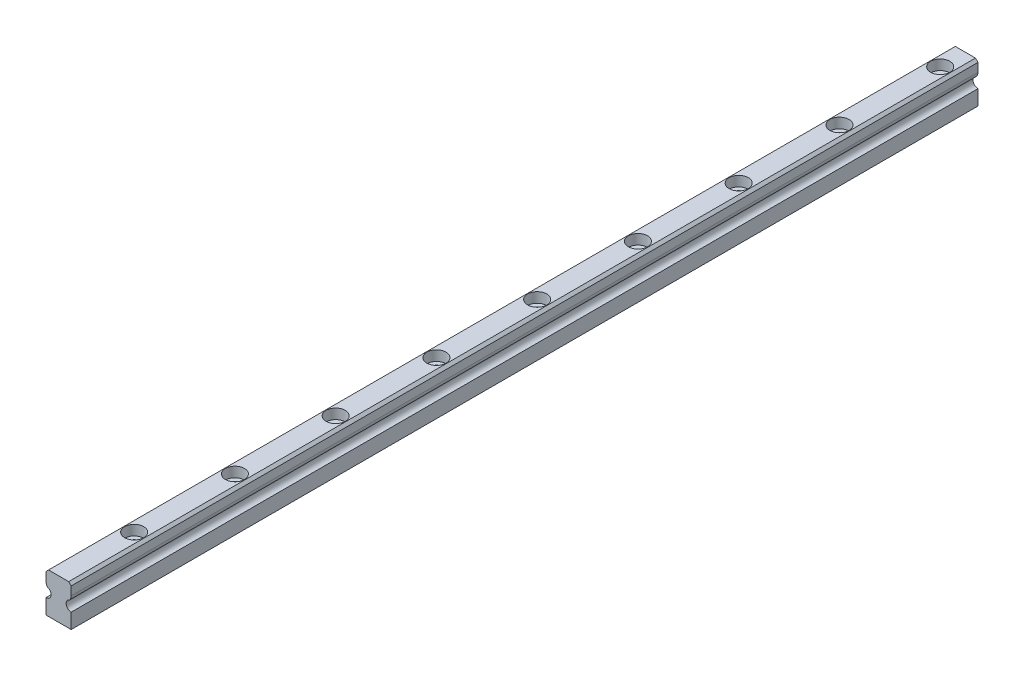
ISO-10303-21;
HEADER;
FILE_DESCRIPTION(('STEP AP214'),'2;1');
FILE_NAME('part.step','',(''),(''),'','','');
FILE_SCHEMA(('AUTOMOTIVE_DESIGN { 1 0 10303 214 1 1 1 1 }'));
ENDSEC;
DATA;
#1=APPLICATION_CONTEXT('core data for automotive mechanical design processes');
#2=APPLICATION_PROTOCOL_DEFINITION('international standard','automotive_design',2000,#1);
#3=PRODUCT_CONTEXT('',#1,'mechanical');
#4=PRODUCT('Part','Part','',(#3));
#5=PRODUCT_RELATED_PRODUCT_CATEGORY('part','',(#4));
#6=PRODUCT_DEFINITION_FORMATION('','',#4);
#7=PRODUCT_DEFINITION_CONTEXT('part definition',#1,'design');
#8=PRODUCT_DEFINITION('design','',#6,#7);
#9=PRODUCT_DEFINITION_SHAPE('','',#8);
#10=(LENGTH_UNIT() NAMED_UNIT(*) SI_UNIT(.MILLI.,.METRE.));
#11=(NAMED_UNIT(*) PLANE_ANGLE_UNIT() SI_UNIT($,.RADIAN.));
#12=(NAMED_UNIT(*) SI_UNIT($,.STERADIAN.) SOLID_ANGLE_UNIT());
#13=UNCERTAINTY_MEASURE_WITH_UNIT(LENGTH_MEASURE(1.E-05),#10,'distance_accuracy_value','');
#14=(GEOMETRIC_REPRESENTATION_CONTEXT(3) GLOBAL_UNCERTAINTY_ASSIGNED_CONTEXT((#13)) GLOBAL_UNIT_ASSIGNED_CONTEXT((#10,
#11,#12)) REPRESENTATION_CONTEXT('',''));
#15=CARTESIAN_POINT('',(0.,0.,0.));
#16=DIRECTION('',(0.,0.,1.));
#17=DIRECTION('',(1.,0.,0.));
#18=AXIS2_PLACEMENT_3D('',#15,#16,#17);
#19=CARTESIAN_POINT('',(-2.5,4.,185.));
#20=DIRECTION('',(1.,0.,0.));
#21=DIRECTION('',(0.,1.,0.));
#22=AXIS2_PLACEMENT_3D('',#19,#20,#21);
#23=PLANE('',#22);
#24=DIRECTION('',(0.,-1.,0.));
#25=VECTOR('',#24,1.);
#26=CARTESIAN_POINT('',(-2.5,3.49999999999997,-20.));
#27=LINE('',#26,#25);
#28=CARTESIAN_POINT('',(-2.5,3.49999999999997,-20.));
#29=VERTEX_POINT('',#28);
#30=CARTESIAN_POINT('',(-2.5,1.79820245321149,-20.));
#31=VERTEX_POINT('',#30);
#32=EDGE_CURVE('E414',#29,#31,#27,.T.);
#33=ORIENTED_EDGE('',*,*,#32,.F.);
#34=DIRECTION('',(0.,0.,-1.));
#35=VECTOR('',#34,1.);
#36=CARTESIAN_POINT('',(-2.5,3.49999999999997,185.));
#37=LINE('',#36,#35);
#38=CARTESIAN_POINT('',(-2.5,3.49999999999997,-200.));
#39=VERTEX_POINT('',#38);
#40=EDGE_CURVE('E185',#29,#39,#37,.T.);
#41=ORIENTED_EDGE('',*,*,#40,.T.);
#42=DIRECTION('',(0.,1.,0.));
#43=VECTOR('',#42,1.);
#44=CARTESIAN_POINT('',(-2.5,4.,-200.));
#45=LINE('',#44,#43);
#46=CARTESIAN_POINT('',(-2.5,1.79820245321149,-200.));
#47=VERTEX_POINT('',#46);
#48=EDGE_CURVE('E250',#47,#39,#45,.T.);
#49=ORIENTED_EDGE('',*,*,#48,.F.);
#50=DIRECTION('',(0.,0.,1.));
#51=VECTOR('',#50,1.);
#52=CARTESIAN_POINT('',(-2.5,1.79820245321149,-200.));
#53=LINE('',#52,#51);
#54=EDGE_CURVE('E160',#47,#31,#53,.T.);
#55=ORIENTED_EDGE('',*,*,#54,.T.);
#56=EDGE_LOOP('',(#33,#41,#49,#55));
#57=FACE_BOUND('',#56,.T.);
#58=ADVANCED_FACE('F50',(#57),#23,.F.);
#59=DIRECTION('',(0.,-1.,0.));
#60=VECTOR('',#59,1.);
#61=CARTESIAN_POINT('',(-2.5,-1.,-20.));
#62=LINE('',#61,#60);
#63=CARTESIAN_POINT('',(-2.5,-1.,-20.));
#64=VERTEX_POINT('',#63);
#65=CARTESIAN_POINT('',(-2.5,-4.,-20.));
#66=VERTEX_POINT('',#65);
#67=EDGE_CURVE('E432',#64,#66,#62,.T.);
#68=ORIENTED_EDGE('',*,*,#67,.F.);
#69=DIRECTION('',(0.,0.,1.));
#70=VECTOR('',#69,1.);
#71=CARTESIAN_POINT('',(-2.5,-1.,-200.));
#72=LINE('',#71,#70);
#73=CARTESIAN_POINT('',(-2.5,-1.,-200.));
#74=VERTEX_POINT('',#73);
#75=EDGE_CURVE('E175',#74,#64,#72,.T.);
#76=ORIENTED_EDGE('',*,*,#75,.F.);
#77=DIRECTION('',(0.,1.,0.));
#78=VECTOR('',#77,1.);
#79=CARTESIAN_POINT('',(-2.5,-1.,-200.));
#80=LINE('',#79,#78);
#81=CARTESIAN_POINT('',(-2.5,-4.,-200.));
#82=VERTEX_POINT('',#81);
#83=EDGE_CURVE('E365',#82,#74,#80,.T.);
#84=ORIENTED_EDGE('',*,*,#83,.F.);
#85=DIRECTION('',(0.,0.,-1.));
#86=VECTOR('',#85,1.);
#87=CARTESIAN_POINT('',(-2.5,-4.,185.));
#88=LINE('',#87,#86);
#89=EDGE_CURVE('E182',#66,#82,#88,.T.);
#90=ORIENTED_EDGE('',*,*,#89,.F.);
#91=EDGE_LOOP('',(#68,#76,#84,#90));
#92=FACE_BOUND('',#91,.T.);
#93=ADVANCED_FACE('F443',(#92),#23,.F.);
#94=CARTESIAN_POINT('',(2.5,-4.,185.));
#95=DIRECTION('',(0.,1.,0.));
#96=DIRECTION('',(-1.,0.,0.));
#97=AXIS2_PLACEMENT_3D('',#94,#95,#96);
#98=PLANE('',#97);
#99=CARTESIAN_POINT('',(1.67729882142548E-12,-4.,-195.));
#100=DIRECTION('',(0.,-1.,0.));
#101=DIRECTION('',(0.,0.,-1.));
#102=AXIS2_PLACEMENT_3D('',#99,#100,#101);
#103=CIRCLE('',#102,1.);
#104=CARTESIAN_POINT('',(1.67729882142548E-12,-4.,-196.));
#105=VERTEX_POINT('',#104);
#106=EDGE_CURVE('E223',#105,#105,#103,.T.);
#107=ORIENTED_EDGE('',*,*,#106,.F.);
#108=EDGE_LOOP('',(#107));
#109=FACE_BOUND('',#108,.T.);
#110=CARTESIAN_POINT('',(1.4678099410949E-12,-4.,-175.));
#111=DIRECTION('',(0.,-1.,0.));
#112=DIRECTION('',(0.,0.,-1.));
#113=AXIS2_PLACEMENT_3D('',#110,#111,#112);
#114=CIRCLE('',#113,1.);
#115=CARTESIAN_POINT('',(1.4678099410949E-12,-4.,-176.));
#116=VERTEX_POINT('',#115);
#117=EDGE_CURVE('E390',#116,#116,#114,.T.);
#118=ORIENTED_EDGE('',*,*,#117,.F.);
#119=EDGE_LOOP('',(#118));
#120=FACE_BOUND('',#119,.T.);
#121=CARTESIAN_POINT('',(1.25832106076431E-12,-4.,-155.));
#122=DIRECTION('',(0.,-1.,0.));
#123=DIRECTION('',(0.,0.,-1.));
#124=AXIS2_PLACEMENT_3D('',#121,#122,#123);
#125=CIRCLE('',#124,1.);
#126=CARTESIAN_POINT('',(1.25832106076431E-12,-4.,-156.));
#127=VERTEX_POINT('',#126);
#128=EDGE_CURVE('E386',#127,#127,#125,.T.);
#129=ORIENTED_EDGE('',*,*,#128,.F.);
#130=EDGE_LOOP('',(#129));
#131=FACE_BOUND('',#130,.T.);
#132=CARTESIAN_POINT('',(1.04883218043372E-12,-4.,-135.));
#133=DIRECTION('',(0.,-1.,0.));
#134=DIRECTION('',(0.,0.,-1.));
#135=AXIS2_PLACEMENT_3D('',#132,#133,#134);
#136=CIRCLE('',#135,1.);
#137=CARTESIAN_POINT('',(1.04883218043372E-12,-4.,-136.));
#138=VERTEX_POINT('',#137);
#139=EDGE_CURVE('E382',#138,#138,#136,.T.);
#140=ORIENTED_EDGE('',*,*,#139,.F.);
#141=EDGE_LOOP('',(#140));
#142=FACE_BOUND('',#141,.T.);
#143=CARTESIAN_POINT('',(8.39343300103133E-13,-4.,-115.));
#144=DIRECTION('',(0.,-1.,0.));
#145=DIRECTION('',(0.,0.,-1.));
#146=AXIS2_PLACEMENT_3D('',#143,#144,#145);
#147=CIRCLE('',#146,1.);
#148=CARTESIAN_POINT('',(8.39343300103133E-13,-4.,-116.));
#149=VERTEX_POINT('',#148);
#150=EDGE_CURVE('E378',#149,#149,#147,.T.);
#151=ORIENTED_EDGE('',*,*,#150,.F.);
#152=EDGE_LOOP('',(#151));
#153=FACE_BOUND('',#152,.T.);
#154=CARTESIAN_POINT('',(6.29854419772545E-13,-4.,-95.));
#155=DIRECTION('',(0.,-1.,0.));
#156=DIRECTION('',(0.,0.,-1.));
#157=AXIS2_PLACEMENT_3D('',#154,#155,#156);
#158=CIRCLE('',#157,1.);
#159=CARTESIAN_POINT('',(6.29854419772545E-13,-4.,-96.));
#160=VERTEX_POINT('',#159);
#161=EDGE_CURVE('E374',#160,#160,#158,.T.);
#162=ORIENTED_EDGE('',*,*,#161,.F.);
#163=EDGE_LOOP('',(#162));
#164=FACE_BOUND('',#163,.T.);
#165=CARTESIAN_POINT('',(4.20365539441957E-13,-4.,-75.));
#166=DIRECTION('',(0.,-1.,0.));
#167=DIRECTION('',(0.,0.,-1.));
#168=AXIS2_PLACEMENT_3D('',#165,#166,#167);
#169=CIRCLE('',#168,1.);
#170=CARTESIAN_POINT('',(4.20365539441957E-13,-4.,-76.));
#171=VERTEX_POINT('',#170);
#172=EDGE_CURVE('E370',#171,#171,#169,.T.);
#173=ORIENTED_EDGE('',*,*,#172,.F.);
#174=EDGE_LOOP('',(#173));
#175=FACE_BOUND('',#174,.T.);
#176=CARTESIAN_POINT('',(2.10876659111369E-13,-4.,-55.));
#177=DIRECTION('',(0.,-1.,0.));
#178=DIRECTION('',(0.,0.,-1.));
#179=AXIS2_PLACEMENT_3D('',#176,#177,#178);
#180=CIRCLE('',#179,1.);
#181=CARTESIAN_POINT('',(2.10876659111369E-13,-4.,-56.));
#182=VERTEX_POINT('',#181);
#183=EDGE_CURVE('E366',#182,#182,#180,.T.);
#184=ORIENTED_EDGE('',*,*,#183,.F.);
#185=EDGE_LOOP('',(#184));
#186=FACE_BOUND('',#185,.T.);
#187=CARTESIAN_POINT('',(0.,-4.,-35.));
#188=DIRECTION('',(0.,-1.,0.));
#189=DIRECTION('',(0.,0.,-1.));
#190=AXIS2_PLACEMENT_3D('',#187,#188,#189);
#191=CIRCLE('',#190,1.);
#192=CARTESIAN_POINT('',(0.,-4.,-36.));
#193=VERTEX_POINT('',#192);
#194=EDGE_CURVE('E361',#193,#193,#191,.T.);
#195=ORIENTED_EDGE('',*,*,#194,.F.);
#196=EDGE_LOOP('',(#195));
#197=FACE_BOUND('',#196,.T.);
#198=DIRECTION('',(1.,0.,0.));
#199=VECTOR('',#198,1.);
#200=CARTESIAN_POINT('',(-2.5,-4.,-20.));
#201=LINE('',#200,#199);
#202=CARTESIAN_POINT('',(2.5,-4.,-20.));
#203=VERTEX_POINT('',#202);
#204=EDGE_CURVE('E291',#66,#203,#201,.T.);
#205=ORIENTED_EDGE('',*,*,#204,.F.);
#206=ORIENTED_EDGE('',*,*,#89,.T.);
#207=DIRECTION('',(-1.,0.,0.));
#208=VECTOR('',#207,1.);
#209=CARTESIAN_POINT('',(-2.5,-4.,-200.));
#210=LINE('',#209,#208);
#211=CARTESIAN_POINT('',(2.5,-4.,-200.));
#212=VERTEX_POINT('',#211);
#213=EDGE_CURVE('E268',#212,#82,#210,.T.);
#214=ORIENTED_EDGE('',*,*,#213,.F.);
#215=DIRECTION('',(0.,0.,-1.));
#216=VECTOR('',#215,1.);
#217=CARTESIAN_POINT('',(2.5,-4.,185.));
#218=LINE('',#217,#216);
#219=EDGE_CURVE('E179',#203,#212,#218,.T.);
#220=ORIENTED_EDGE('',*,*,#219,.F.);
#221=EDGE_LOOP('',(#205,#206,#214,#220));
#222=FACE_BOUND('',#221,.T.);
#223=ADVANCED_FACE('F439',(#109,#120,#131,#142,#153,#164,#175,#186,#197,#222),#98,.F.);
#224=CARTESIAN_POINT('',(2.5,4.,185.));
#225=DIRECTION('',(-1.,0.,0.));
#226=DIRECTION('',(0.,-1.,0.));
#227=AXIS2_PLACEMENT_3D('',#224,#225,#226);
#228=PLANE('',#227);
#229=DIRECTION('',(0.,1.,0.));
#230=VECTOR('',#229,1.);
#231=CARTESIAN_POINT('',(2.5,-4.,-20.));
#232=LINE('',#231,#230);
#233=CARTESIAN_POINT('',(2.5,-1.,-20.));
#234=VERTEX_POINT('',#233);
#235=EDGE_CURVE('E278',#203,#234,#232,.T.);
#236=ORIENTED_EDGE('',*,*,#235,.F.);
#237=ORIENTED_EDGE('',*,*,#219,.T.);
#238=DIRECTION('',(0.,-1.,0.));
#239=VECTOR('',#238,1.);
#240=CARTESIAN_POINT('',(2.5,-4.,-200.));
#241=LINE('',#240,#239);
#242=CARTESIAN_POINT('',(2.5,-1.,-200.));
#243=VERTEX_POINT('',#242);
#244=EDGE_CURVE('E264',#243,#212,#241,.T.);
#245=ORIENTED_EDGE('',*,*,#244,.F.);
#246=DIRECTION('',(0.,0.,1.));
#247=VECTOR('',#246,1.);
#248=CARTESIAN_POINT('',(2.5,-1.,-200.));
#249=LINE('',#248,#247);
#250=EDGE_CURVE('E168',#243,#234,#249,.T.);
#251=ORIENTED_EDGE('',*,*,#250,.T.);
#252=EDGE_LOOP('',(#236,#237,#245,#251));
#253=FACE_BOUND('',#252,.T.);
#254=ADVANCED_FACE('F277',(#253),#228,.F.);
#255=DIRECTION('',(0.,1.,0.));
#256=VECTOR('',#255,1.);
#257=CARTESIAN_POINT('',(2.5,1.7982024532115,-20.));
#258=LINE('',#257,#256);
#259=CARTESIAN_POINT('',(2.5,1.7982024532115,-20.));
#260=VERTEX_POINT('',#259);
#261=CARTESIAN_POINT('',(2.5,3.49999999999997,-20.));
#262=VERTEX_POINT('',#261);
#263=EDGE_CURVE('E66',#260,#262,#258,.T.);
#264=ORIENTED_EDGE('',*,*,#263,.F.);
#265=DIRECTION('',(0.,0.,1.));
#266=VECTOR('',#265,1.);
#267=CARTESIAN_POINT('',(2.5,1.7982024532115,-200.));
#268=LINE('',#267,#266);
#269=CARTESIAN_POINT('',(2.5,1.7982024532115,-200.));
#270=VERTEX_POINT('',#269);
#271=EDGE_CURVE('E151',#270,#260,#268,.T.);
#272=ORIENTED_EDGE('',*,*,#271,.F.);
#273=DIRECTION('',(0.,-1.,0.));
#274=VECTOR('',#273,1.);
#275=CARTESIAN_POINT('',(2.5,4.,-200.));
#276=LINE('',#275,#274);
#277=CARTESIAN_POINT('',(2.5,3.49999999999997,-200.));
#278=VERTEX_POINT('',#277);
#279=EDGE_CURVE('E249',#278,#270,#276,.T.);
#280=ORIENTED_EDGE('',*,*,#279,.F.);
#281=DIRECTION('',(0.,0.,1.));
#282=VECTOR('',#281,1.);
#283=CARTESIAN_POINT('',(2.5,3.49999999999997,185.));
#284=LINE('',#283,#282);
#285=EDGE_CURVE('E13',#278,#262,#284,.T.);
#286=ORIENTED_EDGE('',*,*,#285,.T.);
#287=EDGE_LOOP('',(#264,#272,#280,#286));
#288=FACE_BOUND('',#287,.T.);
#289=ADVANCED_FACE('F150',(#288),#228,.F.);
#290=CARTESIAN_POINT('',(2.5,4.,185.));
#291=DIRECTION('',(0.,-1.,0.));
#292=DIRECTION('',(0.,0.,-1.));
#293=AXIS2_PLACEMENT_3D('',#290,#291,#292);
#294=PLANE('',#293);
#295=CARTESIAN_POINT('',(3.35320986407019E-12,4.,-35.));
#296=DIRECTION('',(0.,1.,0.));
#297=DIRECTION('',(-1.,0.,0.));
#298=AXIS2_PLACEMENT_3D('',#295,#296,#297);
#299=CIRCLE('',#298,1.9);
#300=CARTESIAN_POINT('',(-1.89999999999665,4.,-35.));
#301=VERTEX_POINT('',#300);
#302=EDGE_CURVE('E284',#301,#301,#299,.T.);
#303=ORIENTED_EDGE('',*,*,#302,.F.);
#304=EDGE_LOOP('',(#303));
#305=FACE_BOUND('',#304,.T.);
#306=CARTESIAN_POINT('',(3.1437209837396E-12,4.,-55.));
#307=DIRECTION('',(0.,1.,0.));
#308=DIRECTION('',(-1.,0.,0.));
#309=AXIS2_PLACEMENT_3D('',#306,#307,#308);
#310=CIRCLE('',#309,1.9);
#311=CARTESIAN_POINT('',(-1.89999999999686,4.,-55.));
#312=VERTEX_POINT('',#311);
#313=EDGE_CURVE('E354',#312,#312,#310,.T.);
#314=ORIENTED_EDGE('',*,*,#313,.F.);
#315=EDGE_LOOP('',(#314));
#316=FACE_BOUND('',#315,.T.);
#317=CARTESIAN_POINT('',(2.93423210340901E-12,4.,-75.));
#318=DIRECTION('',(0.,1.,0.));
#319=DIRECTION('',(-1.,0.,0.));
#320=AXIS2_PLACEMENT_3D('',#317,#318,#319);
#321=CIRCLE('',#320,1.9);
#322=CARTESIAN_POINT('',(-1.89999999999707,4.,-75.));
#323=VERTEX_POINT('',#322);
#324=EDGE_CURVE('E346',#323,#323,#321,.T.);
#325=ORIENTED_EDGE('',*,*,#324,.F.);
#326=EDGE_LOOP('',(#325));
#327=FACE_BOUND('',#326,.T.);
#328=CARTESIAN_POINT('',(2.72474322307842E-12,4.,-95.));
#329=DIRECTION('',(0.,1.,0.));
#330=DIRECTION('',(-1.,0.,0.));
#331=AXIS2_PLACEMENT_3D('',#328,#329,#330);
#332=CIRCLE('',#331,1.9);
#333=CARTESIAN_POINT('',(-1.89999999999728,4.,-95.));
#334=VERTEX_POINT('',#333);
#335=EDGE_CURVE('E338',#334,#334,#332,.T.);
#336=ORIENTED_EDGE('',*,*,#335,.F.);
#337=EDGE_LOOP('',(#336));
#338=FACE_BOUND('',#337,.T.);
#339=CARTESIAN_POINT('',(2.51525434274784E-12,4.,-115.));
#340=DIRECTION('',(0.,1.,0.));
#341=DIRECTION('',(-1.,0.,0.));
#342=AXIS2_PLACEMENT_3D('',#339,#340,#341);
#343=CIRCLE('',#342,1.9);
#344=CARTESIAN_POINT('',(-1.89999999999749,4.,-115.));
#345=VERTEX_POINT('',#344);
#346=EDGE_CURVE('E330',#345,#345,#343,.T.);
#347=ORIENTED_EDGE('',*,*,#346,.F.);
#348=EDGE_LOOP('',(#347));
#349=FACE_BOUND('',#348,.T.);
#350=CARTESIAN_POINT('',(2.30576546241725E-12,4.,-135.));
#351=DIRECTION('',(0.,1.,0.));
#352=DIRECTION('',(-1.,0.,0.));
#353=AXIS2_PLACEMENT_3D('',#350,#351,#352);
#354=CIRCLE('',#353,1.90000000000001);
#355=CARTESIAN_POINT('',(-1.8999999999977,4.,-135.));
#356=VERTEX_POINT('',#355);
#357=EDGE_CURVE('E322',#356,#356,#354,.T.);
#358=ORIENTED_EDGE('',*,*,#357,.F.);
#359=EDGE_LOOP('',(#358));
#360=FACE_BOUND('',#359,.T.);
#361=CARTESIAN_POINT('',(2.09627658208666E-12,4.,-155.));
#362=DIRECTION('',(0.,1.,0.));
#363=DIRECTION('',(-1.,0.,0.));
#364=AXIS2_PLACEMENT_3D('',#361,#362,#363);
#365=CIRCLE('',#364,1.90000000000001);
#366=CARTESIAN_POINT('',(-1.89999999999791,4.,-155.));
#367=VERTEX_POINT('',#366);
#368=EDGE_CURVE('E314',#367,#367,#365,.T.);
#369=ORIENTED_EDGE('',*,*,#368,.F.);
#370=EDGE_LOOP('',(#369));
#371=FACE_BOUND('',#370,.T.);
#372=CARTESIAN_POINT('',(1.88678770175607E-12,4.,-175.));
#373=DIRECTION('',(0.,1.,0.));
#374=DIRECTION('',(-1.,0.,0.));
#375=AXIS2_PLACEMENT_3D('',#372,#373,#374);
#376=CIRCLE('',#375,1.90000000000001);
#377=CARTESIAN_POINT('',(-1.89999999999812,4.,-175.));
#378=VERTEX_POINT('',#377);
#379=EDGE_CURVE('E306',#378,#378,#376,.T.);
#380=ORIENTED_EDGE('',*,*,#379,.F.);
#381=EDGE_LOOP('',(#380));
#382=FACE_BOUND('',#381,.T.);
#383=CARTESIAN_POINT('',(1.67729882142548E-12,4.,-195.));
#384=DIRECTION('',(0.,1.,0.));
#385=DIRECTION('',(-1.,0.,0.));
#386=AXIS2_PLACEMENT_3D('',#383,#384,#385);
#387=CIRCLE('',#386,1.90000000000001);
#388=CARTESIAN_POINT('',(-1.89999999999833,4.,-195.));
#389=VERTEX_POINT('',#388);
#390=EDGE_CURVE('E298',#389,#389,#387,.T.);
#391=ORIENTED_EDGE('',*,*,#390,.F.);
#392=EDGE_LOOP('',(#391));
#393=FACE_BOUND('',#392,.T.);
#394=DIRECTION('',(-1.,0.,0.));
#395=VECTOR('',#394,1.);
#396=CARTESIAN_POINT('',(1.99999999999997,4.,-20.));
#397=LINE('',#396,#395);
#398=CARTESIAN_POINT('',(1.99999999999997,4.,-20.));
#399=VERTEX_POINT('',#398);
#400=CARTESIAN_POINT('',(-2.,4.,-20.));
#401=VERTEX_POINT('',#400);
#402=EDGE_CURVE('E243',#399,#401,#397,.T.);
#403=ORIENTED_EDGE('',*,*,#402,.F.);
#404=DIRECTION('',(0.,0.,-1.));
#405=VECTOR('',#404,1.);
#406=CARTESIAN_POINT('',(1.99999999999997,4.,185.));
#407=LINE('',#406,#405);
#408=CARTESIAN_POINT('',(1.99999999999997,4.,-200.));
#409=VERTEX_POINT('',#408);
#410=EDGE_CURVE('E233',#399,#409,#407,.T.);
#411=ORIENTED_EDGE('',*,*,#410,.T.);
#412=DIRECTION('',(1.,0.,0.));
#413=VECTOR('',#412,1.);
#414=CARTESIAN_POINT('',(2.5,4.,-200.));
#415=LINE('',#414,#413);
#416=CARTESIAN_POINT('',(-2.,4.,-200.));
#417=VERTEX_POINT('',#416);
#418=EDGE_CURVE('E241',#417,#409,#415,.T.);
#419=ORIENTED_EDGE('',*,*,#418,.F.);
#420=DIRECTION('',(0.,0.,1.));
#421=VECTOR('',#420,1.);
#422=CARTESIAN_POINT('',(-2.,4.,185.));
#423=LINE('',#422,#421);
#424=EDGE_CURVE('E229',#417,#401,#423,.T.);
#425=ORIENTED_EDGE('',*,*,#424,.T.);
#426=EDGE_LOOP('',(#403,#411,#419,#425));
#427=FACE_BOUND('',#426,.T.);
#428=ADVANCED_FACE('F240',(#305,#316,#327,#338,#349,#360,#371,#382,#393,#427),#294,.F.);
#429=CARTESIAN_POINT('',(-2.5,0.,-200.));
#430=DIRECTION('',(0.,0.,1.));
#431=DIRECTION('',(1.,0.,0.));
#432=AXIS2_PLACEMENT_3D('',#429,#430,#431);
#433=CYLINDRICAL_SURFACE('',#432,1.);
#434=CARTESIAN_POINT('',(-2.5,0.,-20.));
#435=DIRECTION('',(0.,0.,-1.));
#436=DIRECTION('',(1.,0.,0.));
#437=AXIS2_PLACEMENT_3D('',#434,#435,#436);
#438=CIRCLE('',#437,1.);
#439=CARTESIAN_POINT('',(-2.20143290006781,0.95438864559365,-20.));
#440=VERTEX_POINT('',#439);
#441=EDGE_CURVE('E429',#440,#64,#438,.T.);
#442=ORIENTED_EDGE('',*,*,#441,.F.);
#443=DIRECTION('',(0.,0.,1.));
#444=VECTOR('',#443,1.);
#445=CARTESIAN_POINT('',(-2.20143290006781,0.95438864559365,-200.));
#446=LINE('',#445,#444);
#447=CARTESIAN_POINT('',(-2.20143290006781,0.95438864559365,-200.));
#448=VERTEX_POINT('',#447);
#449=EDGE_CURVE('E166',#448,#440,#446,.T.);
#450=ORIENTED_EDGE('',*,*,#449,.F.);
#451=CARTESIAN_POINT('',(-2.5,0.,-200.));
#452=DIRECTION('',(0.,0.,1.));
#453=DIRECTION('',(1.,0.,0.));
#454=AXIS2_PLACEMENT_3D('',#451,#452,#453);
#455=CIRCLE('',#454,1.);
#456=EDGE_CURVE('E400',#74,#448,#455,.T.);
#457=ORIENTED_EDGE('',*,*,#456,.F.);
#458=ORIENTED_EDGE('',*,*,#75,.T.);
#459=EDGE_LOOP('',(#442,#450,#457,#458));
#460=FACE_BOUND('',#459,.T.);
#461=ADVANCED_FACE('F447',(#460),#433,.F.);
#462=CARTESIAN_POINT('',(-1.15831825530943,1.79820245321149,-200.));
#463=DIRECTION('',(0.,0.,1.));
#464=DIRECTION('',(1.,0.,0.));
#465=AXIS2_PLACEMENT_3D('',#462,#463,#464);
#466=CYLINDRICAL_SURFACE('',#465,1.34168174469057);
#467=CARTESIAN_POINT('',(-1.15831825530943,1.79820245321149,-20.));
#468=DIRECTION('',(0.,0.,1.));
#469=DIRECTION('',(1.,0.,0.));
#470=AXIS2_PLACEMENT_3D('',#467,#468,#469);
#471=CIRCLE('',#470,1.34168174469057);
#472=EDGE_CURVE('E410',#31,#440,#471,.T.);
#473=ORIENTED_EDGE('',*,*,#472,.F.);
#474=ORIENTED_EDGE('',*,*,#54,.F.);
#475=CARTESIAN_POINT('',(-1.15831825530943,1.79820245321149,-200.));
#476=DIRECTION('',(0.,0.,-1.));
#477=DIRECTION('',(1.,0.,0.));
#478=AXIS2_PLACEMENT_3D('',#475,#476,#477);
#479=CIRCLE('',#478,1.34168174469057);
#480=EDGE_CURVE('E255',#448,#47,#479,.T.);
#481=ORIENTED_EDGE('',*,*,#480,.F.);
#482=ORIENTED_EDGE('',*,*,#449,.T.);
#483=EDGE_LOOP('',(#473,#474,#481,#482));
#484=FACE_BOUND('',#483,.T.);
#485=ADVANCED_FACE('F409',(#484),#466,.T.);
#486=CARTESIAN_POINT('',(1.15831825530943,1.79820245321149,-200.));
#487=DIRECTION('',(0.,0.,1.));
#488=DIRECTION('',(1.,0.,0.));
#489=AXIS2_PLACEMENT_3D('',#486,#487,#488);
#490=CYLINDRICAL_SURFACE('',#489,1.34168174469057);
#491=CARTESIAN_POINT('',(1.15831825530943,1.79820245321149,-20.));
#492=DIRECTION('',(0.,0.,1.));
#493=DIRECTION('',(1.,0.,0.));
#494=AXIS2_PLACEMENT_3D('',#491,#492,#493);
#495=CIRCLE('',#494,1.34168174469057);
#496=CARTESIAN_POINT('',(2.20143290006781,0.954388645593651,-20.));
#497=VERTEX_POINT('',#496);
#498=EDGE_CURVE('E138',#497,#260,#495,.T.);
#499=ORIENTED_EDGE('',*,*,#498,.F.);
#500=DIRECTION('',(0.,0.,1.));
#501=VECTOR('',#500,1.);
#502=CARTESIAN_POINT('',(2.20143290006781,0.954388645593651,-200.));
#503=LINE('',#502,#501);
#504=CARTESIAN_POINT('',(2.20143290006781,0.954388645593651,-200.));
#505=VERTEX_POINT('',#504);
#506=EDGE_CURVE('E161',#505,#497,#503,.T.);
#507=ORIENTED_EDGE('',*,*,#506,.F.);
#508=CARTESIAN_POINT('',(1.15831825530943,1.79820245321149,-200.));
#509=DIRECTION('',(0.,0.,-1.));
#510=DIRECTION('',(-1.,0.,0.));
#511=AXIS2_PLACEMENT_3D('',#508,#509,#510);
#512=CIRCLE('',#511,1.34168174469057);
#513=EDGE_CURVE('E158',#270,#505,#512,.T.);
#514=ORIENTED_EDGE('',*,*,#513,.F.);
#515=ORIENTED_EDGE('',*,*,#271,.T.);
#516=EDGE_LOOP('',(#499,#507,#514,#515));
#517=FACE_BOUND('',#516,.T.);
#518=ADVANCED_FACE('F157',(#517),#490,.T.);
#519=CARTESIAN_POINT('',(2.5,0.,-200.));
#520=DIRECTION('',(0.,0.,1.));
#521=DIRECTION('',(1.,0.,0.));
#522=AXIS2_PLACEMENT_3D('',#519,#520,#521);
#523=CYLINDRICAL_SURFACE('',#522,1.);
#524=CARTESIAN_POINT('',(2.5,0.,-20.));
#525=DIRECTION('',(0.,0.,-1.));
#526=DIRECTION('',(1.,0.,0.));
#527=AXIS2_PLACEMENT_3D('',#524,#525,#526);
#528=CIRCLE('',#527,1.);
#529=EDGE_CURVE('E141',#234,#497,#528,.T.);
#530=ORIENTED_EDGE('',*,*,#529,.F.);
#531=ORIENTED_EDGE('',*,*,#250,.F.);
#532=CARTESIAN_POINT('',(2.5,0.,-200.));
#533=DIRECTION('',(0.,0.,1.));
#534=DIRECTION('',(-1.,0.,0.));
#535=AXIS2_PLACEMENT_3D('',#532,#533,#534);
#536=CIRCLE('',#535,1.);
#537=EDGE_CURVE('E261',#505,#243,#536,.T.);
#538=ORIENTED_EDGE('',*,*,#537,.F.);
#539=ORIENTED_EDGE('',*,*,#506,.T.);
#540=EDGE_LOOP('',(#530,#531,#538,#539));
#541=FACE_BOUND('',#540,.T.);
#542=ADVANCED_FACE('F282',(#541),#523,.F.);
#543=CARTESIAN_POINT('',(-2.5,3.49999999999997,185.));
#544=DIRECTION('',(0.707106781186567,-0.707106781186528,0.));
#545=DIRECTION('',(0.,0.,-1.));
#546=AXIS2_PLACEMENT_3D('',#543,#544,#545);
#547=PLANE('',#546);
#548=ORIENTED_EDGE('',*,*,#40,.F.);
#549=DIRECTION('',(-0.707106781186528,-0.707106781186567,0.));
#550=VECTOR('',#549,1.);
#551=CARTESIAN_POINT('',(-2.,4.,-20.));
#552=LINE('',#551,#550);
#553=EDGE_CURVE('E418',#401,#29,#552,.T.);
#554=ORIENTED_EDGE('',*,*,#553,.F.);
#555=ORIENTED_EDGE('',*,*,#424,.F.);
#556=DIRECTION('',(-0.707106781186528,-0.707106781186567,0.));
#557=VECTOR('',#556,1.);
#558=CARTESIAN_POINT('',(-1.75000000000013,4.24999999999989,-200.));
#559=LINE('',#558,#557);
#560=EDGE_CURVE('E226',#39,#417,#559,.F.);
#561=ORIENTED_EDGE('',*,*,#560,.F.);
#562=EDGE_LOOP('',(#548,#554,#555,#561));
#563=FACE_BOUND('',#562,.T.);
#564=ADVANCED_FACE('F417',(#563),#547,.F.);
#565=CARTESIAN_POINT('',(1.99999999999997,4.,185.));
#566=DIRECTION('',(-0.707106781186548,-0.707106781186548,0.));
#567=DIRECTION('',(0.,0.,-1.));
#568=AXIS2_PLACEMENT_3D('',#565,#566,#567);
#569=PLANE('',#568);
#570=ORIENTED_EDGE('',*,*,#410,.F.);
#571=DIRECTION('',(-0.707106781186548,0.707106781186548,0.));
#572=VECTOR('',#571,1.);
#573=CARTESIAN_POINT('',(2.5,3.49999999999997,-20.));
#574=LINE('',#573,#572);
#575=EDGE_CURVE('E155',#262,#399,#574,.T.);
#576=ORIENTED_EDGE('',*,*,#575,.F.);
#577=ORIENTED_EDGE('',*,*,#285,.F.);
#578=DIRECTION('',(-0.707106781186548,0.707106781186548,0.));
#579=VECTOR('',#578,1.);
#580=CARTESIAN_POINT('',(4.24999999999999,1.74999999999999,-200.));
#581=LINE('',#580,#579);
#582=EDGE_CURVE('E59',#409,#278,#581,.F.);
#583=ORIENTED_EDGE('',*,*,#582,.F.);
#584=EDGE_LOOP('',(#570,#576,#577,#583));
#585=FACE_BOUND('',#584,.T.);
#586=ADVANCED_FACE('F52',(#585),#569,.F.);
#587=CARTESIAN_POINT('',(1.67729882142548E-12,4.001,-195.));
#588=DIRECTION('',(0.,-1.,0.));
#589=DIRECTION('',(0.,0.,-1.));
#590=AXIS2_PLACEMENT_3D('',#587,#588,#589);
#591=CYLINDRICAL_SURFACE('',#590,1.);
#592=ORIENTED_EDGE('',*,*,#106,.T.);
#593=EDGE_LOOP('',(#592));
#594=FACE_BOUND('',#593,.T.);
#595=CARTESIAN_POINT('',(1.67729882142548E-12,2.,-195.));
#596=DIRECTION('',(0.,1.,0.));
#597=DIRECTION('',(-1.,0.,0.));
#598=AXIS2_PLACEMENT_3D('',#595,#596,#597);
#599=CIRCLE('',#598,1.);
#600=CARTESIAN_POINT('',(-0.999999999998324,2.,-195.));
#601=VERTEX_POINT('',#600);
#602=EDGE_CURVE('E219',#601,#601,#599,.F.);
#603=ORIENTED_EDGE('',*,*,#602,.F.);
#604=EDGE_LOOP('',(#603));
#605=FACE_BOUND('',#604,.T.);
#606=ADVANCED_FACE('F470',(#594,#605),#591,.F.);
#607=CARTESIAN_POINT('',(1.4678099410949E-12,4.001,-175.));
#608=DIRECTION('',(0.,-1.,0.));
#609=DIRECTION('',(0.,0.,-1.));
#610=AXIS2_PLACEMENT_3D('',#607,#608,#609);
#611=CYLINDRICAL_SURFACE('',#610,1.);
#612=ORIENTED_EDGE('',*,*,#117,.T.);
#613=EDGE_LOOP('',(#612));
#614=FACE_BOUND('',#613,.T.);
#615=CARTESIAN_POINT('',(1.4678099410949E-12,2.,-175.));
#616=DIRECTION('',(0.,1.,0.));
#617=DIRECTION('',(-1.,0.,0.));
#618=AXIS2_PLACEMENT_3D('',#615,#616,#617);
#619=CIRCLE('',#618,1.);
#620=CARTESIAN_POINT('',(-0.999999999998533,2.,-175.));
#621=VERTEX_POINT('',#620);
#622=EDGE_CURVE('E215',#621,#621,#619,.F.);
#623=ORIENTED_EDGE('',*,*,#622,.F.);
#624=EDGE_LOOP('',(#623));
#625=FACE_BOUND('',#624,.T.);
#626=ADVANCED_FACE('F483',(#614,#625),#611,.F.);
#627=CARTESIAN_POINT('',(1.25832106076431E-12,4.001,-155.));
#628=DIRECTION('',(0.,-1.,0.));
#629=DIRECTION('',(0.,0.,-1.));
#630=AXIS2_PLACEMENT_3D('',#627,#628,#629);
#631=CYLINDRICAL_SURFACE('',#630,1.);
#632=ORIENTED_EDGE('',*,*,#128,.T.);
#633=EDGE_LOOP('',(#632));
#634=FACE_BOUND('',#633,.T.);
#635=CARTESIAN_POINT('',(1.25832106076431E-12,2.,-155.));
#636=DIRECTION('',(0.,1.,0.));
#637=DIRECTION('',(-1.,0.,0.));
#638=AXIS2_PLACEMENT_3D('',#635,#636,#637);
#639=CIRCLE('',#638,1.);
#640=CARTESIAN_POINT('',(-0.999999999998743,2.,-155.));
#641=VERTEX_POINT('',#640);
#642=EDGE_CURVE('E211',#641,#641,#639,.F.);
#643=ORIENTED_EDGE('',*,*,#642,.F.);
#644=EDGE_LOOP('',(#643));
#645=FACE_BOUND('',#644,.T.);
#646=ADVANCED_FACE('F487',(#634,#645),#631,.F.);
#647=CARTESIAN_POINT('',(1.04883218043372E-12,4.001,-135.));
#648=DIRECTION('',(0.,-1.,0.));
#649=DIRECTION('',(0.,0.,-1.));
#650=AXIS2_PLACEMENT_3D('',#647,#648,#649);
#651=CYLINDRICAL_SURFACE('',#650,1.);
#652=ORIENTED_EDGE('',*,*,#139,.T.);
#653=EDGE_LOOP('',(#652));
#654=FACE_BOUND('',#653,.T.);
#655=CARTESIAN_POINT('',(1.04883218043372E-12,2.,-135.));
#656=DIRECTION('',(0.,1.,0.));
#657=DIRECTION('',(-1.,0.,0.));
#658=AXIS2_PLACEMENT_3D('',#655,#656,#657);
#659=CIRCLE('',#658,1.);
#660=CARTESIAN_POINT('',(-0.999999999998952,2.,-135.));
#661=VERTEX_POINT('',#660);
#662=EDGE_CURVE('E207',#661,#661,#659,.F.);
#663=ORIENTED_EDGE('',*,*,#662,.F.);
#664=EDGE_LOOP('',(#663));
#665=FACE_BOUND('',#664,.T.);
#666=ADVANCED_FACE('F491',(#654,#665),#651,.F.);
#667=CARTESIAN_POINT('',(8.39343300103133E-13,4.001,-115.));
#668=DIRECTION('',(0.,-1.,0.));
#669=DIRECTION('',(0.,0.,-1.));
#670=AXIS2_PLACEMENT_3D('',#667,#668,#669);
#671=CYLINDRICAL_SURFACE('',#670,1.);
#672=ORIENTED_EDGE('',*,*,#150,.T.);
#673=EDGE_LOOP('',(#672));
#674=FACE_BOUND('',#673,.T.);
#675=CARTESIAN_POINT('',(8.39343300103133E-13,2.,-115.));
#676=DIRECTION('',(0.,1.,0.));
#677=DIRECTION('',(-1.,0.,0.));
#678=AXIS2_PLACEMENT_3D('',#675,#676,#677);
#679=CIRCLE('',#678,1.);
#680=CARTESIAN_POINT('',(-0.999999999999161,2.,-115.));
#681=VERTEX_POINT('',#680);
#682=EDGE_CURVE('E203',#681,#681,#679,.F.);
#683=ORIENTED_EDGE('',*,*,#682,.F.);
#684=EDGE_LOOP('',(#683));
#685=FACE_BOUND('',#684,.T.);
#686=ADVANCED_FACE('F495',(#674,#685),#671,.F.);
#687=CARTESIAN_POINT('',(6.29854419772545E-13,4.001,-95.));
#688=DIRECTION('',(0.,-1.,0.));
#689=DIRECTION('',(0.,0.,-1.));
#690=AXIS2_PLACEMENT_3D('',#687,#688,#689);
#691=CYLINDRICAL_SURFACE('',#690,1.);
#692=ORIENTED_EDGE('',*,*,#161,.T.);
#693=EDGE_LOOP('',(#692));
#694=FACE_BOUND('',#693,.T.);
#695=CARTESIAN_POINT('',(6.29854419772545E-13,2.,-95.));
#696=DIRECTION('',(0.,1.,0.));
#697=DIRECTION('',(-1.,0.,0.));
#698=AXIS2_PLACEMENT_3D('',#695,#696,#697);
#699=CIRCLE('',#698,1.);
#700=CARTESIAN_POINT('',(-0.999999999999371,2.,-95.));
#701=VERTEX_POINT('',#700);
#702=EDGE_CURVE('E199',#701,#701,#699,.F.);
#703=ORIENTED_EDGE('',*,*,#702,.F.);
#704=EDGE_LOOP('',(#703));
#705=FACE_BOUND('',#704,.T.);
#706=ADVANCED_FACE('F499',(#694,#705),#691,.F.);
#707=CARTESIAN_POINT('',(4.20365539441957E-13,4.001,-75.));
#708=DIRECTION('',(0.,-1.,0.));
#709=DIRECTION('',(0.,0.,-1.));
#710=AXIS2_PLACEMENT_3D('',#707,#708,#709);
#711=CYLINDRICAL_SURFACE('',#710,1.);
#712=ORIENTED_EDGE('',*,*,#172,.T.);
#713=EDGE_LOOP('',(#712));
#714=FACE_BOUND('',#713,.T.);
#715=CARTESIAN_POINT('',(4.20365539441957E-13,2.,-75.));
#716=DIRECTION('',(0.,1.,0.));
#717=DIRECTION('',(-1.,0.,0.));
#718=AXIS2_PLACEMENT_3D('',#715,#716,#717);
#719=CIRCLE('',#718,1.);
#720=CARTESIAN_POINT('',(-0.99999999999958,2.,-75.));
#721=VERTEX_POINT('',#720);
#722=EDGE_CURVE('E195',#721,#721,#719,.F.);
#723=ORIENTED_EDGE('',*,*,#722,.F.);
#724=EDGE_LOOP('',(#723));
#725=FACE_BOUND('',#724,.T.);
#726=ADVANCED_FACE('F503',(#714,#725),#711,.F.);
#727=CARTESIAN_POINT('',(2.10876659111369E-13,4.001,-55.));
#728=DIRECTION('',(0.,-1.,0.));
#729=DIRECTION('',(0.,0.,-1.));
#730=AXIS2_PLACEMENT_3D('',#727,#728,#729);
#731=CYLINDRICAL_SURFACE('',#730,1.);
#732=ORIENTED_EDGE('',*,*,#183,.T.);
#733=EDGE_LOOP('',(#732));
#734=FACE_BOUND('',#733,.T.);
#735=CARTESIAN_POINT('',(2.10876659111369E-13,2.,-55.));
#736=DIRECTION('',(0.,1.,0.));
#737=DIRECTION('',(-1.,0.,0.));
#738=AXIS2_PLACEMENT_3D('',#735,#736,#737);
#739=CIRCLE('',#738,1.);
#740=CARTESIAN_POINT('',(-0.99999999999979,2.,-55.));
#741=VERTEX_POINT('',#740);
#742=EDGE_CURVE('E190',#741,#741,#739,.F.);
#743=ORIENTED_EDGE('',*,*,#742,.F.);
#744=EDGE_LOOP('',(#743));
#745=FACE_BOUND('',#744,.T.);
#746=ADVANCED_FACE('F507',(#734,#745),#731,.F.);
#747=CARTESIAN_POINT('',(0.,4.001,-35.));
#748=DIRECTION('',(0.,-1.,0.));
#749=DIRECTION('',(0.,0.,-1.));
#750=AXIS2_PLACEMENT_3D('',#747,#748,#749);
#751=CYLINDRICAL_SURFACE('',#750,1.);
#752=ORIENTED_EDGE('',*,*,#194,.T.);
#753=EDGE_LOOP('',(#752));
#754=FACE_BOUND('',#753,.T.);
#755=CARTESIAN_POINT('',(0.,2.,-35.));
#756=DIRECTION('',(0.,1.,0.));
#757=DIRECTION('',(-1.,0.,0.));
#758=AXIS2_PLACEMENT_3D('',#755,#756,#757);
#759=CIRCLE('',#758,1.);
#760=CARTESIAN_POINT('',(-1.,2.,-35.));
#761=VERTEX_POINT('',#760);
#762=EDGE_CURVE('E186',#761,#761,#759,.F.);
#763=ORIENTED_EDGE('',*,*,#762,.F.);
#764=EDGE_LOOP('',(#763));
#765=FACE_BOUND('',#764,.T.);
#766=ADVANCED_FACE('F480',(#754,#765),#751,.F.);
#767=CARTESIAN_POINT('',(2.5,0.,-200.));
#768=DIRECTION('',(0.,0.,-1.));
#769=DIRECTION('',(-1.,0.,0.));
#770=AXIS2_PLACEMENT_3D('',#767,#768,#769);
#771=PLANE('',#770);
#772=ORIENTED_EDGE('',*,*,#418,.T.);
#773=ORIENTED_EDGE('',*,*,#582,.T.);
#774=ORIENTED_EDGE('',*,*,#279,.T.);
#775=ORIENTED_EDGE('',*,*,#513,.T.);
#776=ORIENTED_EDGE('',*,*,#537,.T.);
#777=ORIENTED_EDGE('',*,*,#244,.T.);
#778=ORIENTED_EDGE('',*,*,#213,.T.);
#779=ORIENTED_EDGE('',*,*,#83,.T.);
#780=ORIENTED_EDGE('',*,*,#456,.T.);
#781=ORIENTED_EDGE('',*,*,#480,.T.);
#782=ORIENTED_EDGE('',*,*,#48,.T.);
#783=ORIENTED_EDGE('',*,*,#560,.T.);
#784=EDGE_LOOP('',(#772,#773,#774,#775,#776,#777,#778,#779,#780,#781,#782,#783));
#785=FACE_BOUND('',#784,.T.);
#786=ADVANCED_FACE('F245',(#785),#771,.T.);
#787=CARTESIAN_POINT('',(3.35338333641779E-12,2.,-35.));
#788=DIRECTION('',(0.,1.,0.));
#789=DIRECTION('',(-1.,0.,0.));
#790=AXIS2_PLACEMENT_3D('',#787,#788,#789);
#791=PLANE('',#790);
#792=CARTESIAN_POINT('',(3.35338333641779E-12,2.,-35.));
#793=DIRECTION('',(0.,1.,0.));
#794=DIRECTION('',(-1.,0.,0.));
#795=AXIS2_PLACEMENT_3D('',#792,#793,#794);
#796=CIRCLE('',#795,1.9);
#797=CARTESIAN_POINT('',(-1.89999999999665,2.,-35.));
#798=VERTEX_POINT('',#797);
#799=EDGE_CURVE('E289',#798,#798,#796,.T.);
#800=ORIENTED_EDGE('',*,*,#799,.T.);
#801=EDGE_LOOP('',(#800));
#802=FACE_BOUND('',#801,.T.);
#803=ORIENTED_EDGE('',*,*,#762,.T.);
#804=EDGE_LOOP('',(#803));
#805=FACE_BOUND('',#804,.T.);
#806=ADVANCED_FACE('F479',(#802,#805),#791,.T.);
#807=CARTESIAN_POINT('',(3.35338333641779E-12,2.,-35.));
#808=DIRECTION('',(0.,1.,0.));
#809=DIRECTION('',(-1.,0.,0.));
#810=AXIS2_PLACEMENT_3D('',#807,#808,#809);
#811=CYLINDRICAL_SURFACE('',#810,1.9);
#812=ORIENTED_EDGE('',*,*,#799,.F.);
#813=EDGE_LOOP('',(#812));
#814=FACE_BOUND('',#813,.T.);
#815=ORIENTED_EDGE('',*,*,#302,.T.);
#816=EDGE_LOOP('',(#815));
#817=FACE_BOUND('',#816,.T.);
#818=ADVANCED_FACE('F515',(#814,#817),#811,.F.);
#819=CARTESIAN_POINT('',(3.1438944560872E-12,2.,-55.));
#820=DIRECTION('',(0.,1.,0.));
#821=DIRECTION('',(-1.,0.,0.));
#822=AXIS2_PLACEMENT_3D('',#819,#820,#821);
#823=PLANE('',#822);
#824=CARTESIAN_POINT('',(3.1438944560872E-12,2.,-55.));
#825=DIRECTION('',(0.,1.,0.));
#826=DIRECTION('',(-1.,0.,0.));
#827=AXIS2_PLACEMENT_3D('',#824,#825,#826);
#828=CIRCLE('',#827,1.9);
#829=CARTESIAN_POINT('',(-1.89999999999686,2.,-55.));
#830=VERTEX_POINT('',#829);
#831=EDGE_CURVE('E350',#830,#830,#828,.T.);
#832=ORIENTED_EDGE('',*,*,#831,.T.);
#833=EDGE_LOOP('',(#832));
#834=FACE_BOUND('',#833,.T.);
#835=ORIENTED_EDGE('',*,*,#742,.T.);
#836=EDGE_LOOP('',(#835));
#837=FACE_BOUND('',#836,.T.);
#838=ADVANCED_FACE('F518',(#834,#837),#823,.T.);
#839=CARTESIAN_POINT('',(3.1438944560872E-12,2.,-55.));
#840=DIRECTION('',(0.,1.,0.));
#841=DIRECTION('',(-1.,0.,0.));
#842=AXIS2_PLACEMENT_3D('',#839,#840,#841);
#843=CYLINDRICAL_SURFACE('',#842,1.9);
#844=ORIENTED_EDGE('',*,*,#831,.F.);
#845=EDGE_LOOP('',(#844));
#846=FACE_BOUND('',#845,.T.);
#847=ORIENTED_EDGE('',*,*,#313,.T.);
#848=EDGE_LOOP('',(#847));
#849=FACE_BOUND('',#848,.T.);
#850=ADVANCED_FACE('F523',(#846,#849),#843,.F.);
#851=CARTESIAN_POINT('',(2.93440557575661E-12,2.,-75.));
#852=DIRECTION('',(0.,1.,0.));
#853=DIRECTION('',(-1.,0.,0.));
#854=AXIS2_PLACEMENT_3D('',#851,#852,#853);
#855=PLANE('',#854);
#856=CARTESIAN_POINT('',(2.93440557575661E-12,2.,-75.));
#857=DIRECTION('',(0.,1.,0.));
#858=DIRECTION('',(-1.,0.,0.));
#859=AXIS2_PLACEMENT_3D('',#856,#857,#858);
#860=CIRCLE('',#859,1.9);
#861=CARTESIAN_POINT('',(-1.89999999999707,2.,-75.));
#862=VERTEX_POINT('',#861);
#863=EDGE_CURVE('E342',#862,#862,#860,.T.);
#864=ORIENTED_EDGE('',*,*,#863,.T.);
#865=EDGE_LOOP('',(#864));
#866=FACE_BOUND('',#865,.T.);
#867=ORIENTED_EDGE('',*,*,#722,.T.);
#868=EDGE_LOOP('',(#867));
#869=FACE_BOUND('',#868,.T.);
#870=ADVANCED_FACE('F526',(#866,#869),#855,.T.);
#871=CARTESIAN_POINT('',(2.93440557575661E-12,2.,-75.));
#872=DIRECTION('',(0.,1.,0.));
#873=DIRECTION('',(-1.,0.,0.));
#874=AXIS2_PLACEMENT_3D('',#871,#872,#873);
#875=CYLINDRICAL_SURFACE('',#874,1.9);
#876=ORIENTED_EDGE('',*,*,#863,.F.);
#877=EDGE_LOOP('',(#876));
#878=FACE_BOUND('',#877,.T.);
#879=ORIENTED_EDGE('',*,*,#324,.T.);
#880=EDGE_LOOP('',(#879));
#881=FACE_BOUND('',#880,.T.);
#882=ADVANCED_FACE('F531',(#878,#881),#875,.F.);
#883=CARTESIAN_POINT('',(2.72491669542602E-12,2.,-95.));
#884=DIRECTION('',(0.,1.,0.));
#885=DIRECTION('',(-1.,0.,0.));
#886=AXIS2_PLACEMENT_3D('',#883,#884,#885);
#887=PLANE('',#886);
#888=CARTESIAN_POINT('',(2.72491669542602E-12,2.,-95.));
#889=DIRECTION('',(0.,1.,0.));
#890=DIRECTION('',(-1.,0.,0.));
#891=AXIS2_PLACEMENT_3D('',#888,#889,#890);
#892=CIRCLE('',#891,1.9);
#893=CARTESIAN_POINT('',(-1.89999999999728,2.,-95.));
#894=VERTEX_POINT('',#893);
#895=EDGE_CURVE('E334',#894,#894,#892,.T.);
#896=ORIENTED_EDGE('',*,*,#895,.T.);
#897=EDGE_LOOP('',(#896));
#898=FACE_BOUND('',#897,.T.);
#899=ORIENTED_EDGE('',*,*,#702,.T.);
#900=EDGE_LOOP('',(#899));
#901=FACE_BOUND('',#900,.T.);
#902=ADVANCED_FACE('F534',(#898,#901),#887,.T.);
#903=CARTESIAN_POINT('',(2.72491669542602E-12,2.,-95.));
#904=DIRECTION('',(0.,1.,0.));
#905=DIRECTION('',(-1.,0.,0.));
#906=AXIS2_PLACEMENT_3D('',#903,#904,#905);
#907=CYLINDRICAL_SURFACE('',#906,1.9);
#908=ORIENTED_EDGE('',*,*,#895,.F.);
#909=EDGE_LOOP('',(#908));
#910=FACE_BOUND('',#909,.T.);
#911=ORIENTED_EDGE('',*,*,#335,.T.);
#912=EDGE_LOOP('',(#911));
#913=FACE_BOUND('',#912,.T.);
#914=ADVANCED_FACE('F539',(#910,#913),#907,.F.);
#915=CARTESIAN_POINT('',(2.51542781509543E-12,2.,-115.));
#916=DIRECTION('',(0.,1.,0.));
#917=DIRECTION('',(-1.,0.,0.));
#918=AXIS2_PLACEMENT_3D('',#915,#916,#917);
#919=PLANE('',#918);
#920=CARTESIAN_POINT('',(2.51542781509543E-12,2.,-115.));
#921=DIRECTION('',(0.,1.,0.));
#922=DIRECTION('',(-1.,0.,0.));
#923=AXIS2_PLACEMENT_3D('',#920,#921,#922);
#924=CIRCLE('',#923,1.9);
#925=CARTESIAN_POINT('',(-1.89999999999749,2.,-115.));
#926=VERTEX_POINT('',#925);
#927=EDGE_CURVE('E326',#926,#926,#924,.T.);
#928=ORIENTED_EDGE('',*,*,#927,.T.);
#929=EDGE_LOOP('',(#928));
#930=FACE_BOUND('',#929,.T.);
#931=ORIENTED_EDGE('',*,*,#682,.T.);
#932=EDGE_LOOP('',(#931));
#933=FACE_BOUND('',#932,.T.);
#934=ADVANCED_FACE('F542',(#930,#933),#919,.T.);
#935=CARTESIAN_POINT('',(2.51542781509543E-12,2.,-115.));
#936=DIRECTION('',(0.,1.,0.));
#937=DIRECTION('',(-1.,0.,0.));
#938=AXIS2_PLACEMENT_3D('',#935,#936,#937);
#939=CYLINDRICAL_SURFACE('',#938,1.9);
#940=ORIENTED_EDGE('',*,*,#927,.F.);
#941=EDGE_LOOP('',(#940));
#942=FACE_BOUND('',#941,.T.);
#943=ORIENTED_EDGE('',*,*,#346,.T.);
#944=EDGE_LOOP('',(#943));
#945=FACE_BOUND('',#944,.T.);
#946=ADVANCED_FACE('F547',(#942,#945),#939,.F.);
#947=CARTESIAN_POINT('',(2.30593893476485E-12,2.,-135.));
#948=DIRECTION('',(0.,1.,0.));
#949=DIRECTION('',(-1.,0.,0.));
#950=AXIS2_PLACEMENT_3D('',#947,#948,#949);
#951=PLANE('',#950);
#952=CARTESIAN_POINT('',(2.30593893476485E-12,2.,-135.));
#953=DIRECTION('',(0.,1.,0.));
#954=DIRECTION('',(-1.,0.,0.));
#955=AXIS2_PLACEMENT_3D('',#952,#953,#954);
#956=CIRCLE('',#955,1.90000000000001);
#957=CARTESIAN_POINT('',(-1.8999999999977,2.,-135.));
#958=VERTEX_POINT('',#957);
#959=EDGE_CURVE('E318',#958,#958,#956,.T.);
#960=ORIENTED_EDGE('',*,*,#959,.T.);
#961=EDGE_LOOP('',(#960));
#962=FACE_BOUND('',#961,.T.);
#963=ORIENTED_EDGE('',*,*,#662,.T.);
#964=EDGE_LOOP('',(#963));
#965=FACE_BOUND('',#964,.T.);
#966=ADVANCED_FACE('F550',(#962,#965),#951,.T.);
#967=CARTESIAN_POINT('',(2.30593893476485E-12,2.,-135.));
#968=DIRECTION('',(0.,1.,0.));
#969=DIRECTION('',(-1.,0.,0.));
#970=AXIS2_PLACEMENT_3D('',#967,#968,#969);
#971=CYLINDRICAL_SURFACE('',#970,1.90000000000001);
#972=ORIENTED_EDGE('',*,*,#959,.F.);
#973=EDGE_LOOP('',(#972));
#974=FACE_BOUND('',#973,.T.);
#975=ORIENTED_EDGE('',*,*,#357,.T.);
#976=EDGE_LOOP('',(#975));
#977=FACE_BOUND('',#976,.T.);
#978=ADVANCED_FACE('F555',(#974,#977),#971,.F.);
#979=CARTESIAN_POINT('',(2.09645005443426E-12,2.,-155.));
#980=DIRECTION('',(0.,1.,0.));
#981=DIRECTION('',(-1.,0.,0.));
#982=AXIS2_PLACEMENT_3D('',#979,#980,#981);
#983=PLANE('',#982);
#984=CARTESIAN_POINT('',(2.09645005443426E-12,2.,-155.));
#985=DIRECTION('',(0.,1.,0.));
#986=DIRECTION('',(-1.,0.,0.));
#987=AXIS2_PLACEMENT_3D('',#984,#985,#986);
#988=CIRCLE('',#987,1.90000000000001);
#989=CARTESIAN_POINT('',(-1.89999999999791,2.,-155.));
#990=VERTEX_POINT('',#989);
#991=EDGE_CURVE('E310',#990,#990,#988,.T.);
#992=ORIENTED_EDGE('',*,*,#991,.T.);
#993=EDGE_LOOP('',(#992));
#994=FACE_BOUND('',#993,.T.);
#995=ORIENTED_EDGE('',*,*,#642,.T.);
#996=EDGE_LOOP('',(#995));
#997=FACE_BOUND('',#996,.T.);
#998=ADVANCED_FACE('F558',(#994,#997),#983,.T.);
#999=CARTESIAN_POINT('',(2.09645005443426E-12,2.,-155.));
#1000=DIRECTION('',(0.,1.,0.));
#1001=DIRECTION('',(-1.,0.,0.));
#1002=AXIS2_PLACEMENT_3D('',#999,#1000,#1001);
#1003=CYLINDRICAL_SURFACE('',#1002,1.90000000000001);
#1004=ORIENTED_EDGE('',*,*,#991,.F.);
#1005=EDGE_LOOP('',(#1004));
#1006=FACE_BOUND('',#1005,.T.);
#1007=ORIENTED_EDGE('',*,*,#368,.T.);
#1008=EDGE_LOOP('',(#1007));
#1009=FACE_BOUND('',#1008,.T.);
#1010=ADVANCED_FACE('F563',(#1006,#1009),#1003,.F.);
#1011=CARTESIAN_POINT('',(1.88696117410367E-12,2.,-175.));
#1012=DIRECTION('',(0.,1.,0.));
#1013=DIRECTION('',(-1.,0.,0.));
#1014=AXIS2_PLACEMENT_3D('',#1011,#1012,#1013);
#1015=PLANE('',#1014);
#1016=CARTESIAN_POINT('',(1.88696117410367E-12,2.,-175.));
#1017=DIRECTION('',(0.,1.,0.));
#1018=DIRECTION('',(-1.,0.,0.));
#1019=AXIS2_PLACEMENT_3D('',#1016,#1017,#1018);
#1020=CIRCLE('',#1019,1.90000000000001);
#1021=CARTESIAN_POINT('',(-1.89999999999812,2.,-175.));
#1022=VERTEX_POINT('',#1021);
#1023=EDGE_CURVE('E302',#1022,#1022,#1020,.T.);
#1024=ORIENTED_EDGE('',*,*,#1023,.T.);
#1025=EDGE_LOOP('',(#1024));
#1026=FACE_BOUND('',#1025,.T.);
#1027=ORIENTED_EDGE('',*,*,#622,.T.);
#1028=EDGE_LOOP('',(#1027));
#1029=FACE_BOUND('',#1028,.T.);
#1030=ADVANCED_FACE('F566',(#1026,#1029),#1015,.T.);
#1031=CARTESIAN_POINT('',(1.88696117410367E-12,2.,-175.));
#1032=DIRECTION('',(0.,1.,0.));
#1033=DIRECTION('',(-1.,0.,0.));
#1034=AXIS2_PLACEMENT_3D('',#1031,#1032,#1033);
#1035=CYLINDRICAL_SURFACE('',#1034,1.90000000000001);
#1036=ORIENTED_EDGE('',*,*,#1023,.F.);
#1037=EDGE_LOOP('',(#1036));
#1038=FACE_BOUND('',#1037,.T.);
#1039=ORIENTED_EDGE('',*,*,#379,.T.);
#1040=EDGE_LOOP('',(#1039));
#1041=FACE_BOUND('',#1040,.T.);
#1042=ADVANCED_FACE('F571',(#1038,#1041),#1035,.F.);
#1043=CARTESIAN_POINT('',(1.67747229377308E-12,2.,-195.));
#1044=DIRECTION('',(0.,1.,0.));
#1045=DIRECTION('',(-1.,0.,0.));
#1046=AXIS2_PLACEMENT_3D('',#1043,#1044,#1045);
#1047=PLANE('',#1046);
#1048=CARTESIAN_POINT('',(1.67747229377308E-12,2.,-195.));
#1049=DIRECTION('',(0.,1.,0.));
#1050=DIRECTION('',(-1.,0.,0.));
#1051=AXIS2_PLACEMENT_3D('',#1048,#1049,#1050);
#1052=CIRCLE('',#1051,1.90000000000001);
#1053=CARTESIAN_POINT('',(-1.89999999999833,2.,-195.));
#1054=VERTEX_POINT('',#1053);
#1055=EDGE_CURVE('E191',#1054,#1054,#1052,.T.);
#1056=ORIENTED_EDGE('',*,*,#1055,.T.);
#1057=EDGE_LOOP('',(#1056));
#1058=FACE_BOUND('',#1057,.T.);
#1059=ORIENTED_EDGE('',*,*,#602,.T.);
#1060=EDGE_LOOP('',(#1059));
#1061=FACE_BOUND('',#1060,.T.);
#1062=ADVANCED_FACE('F574',(#1058,#1061),#1047,.T.);
#1063=CARTESIAN_POINT('',(1.67747229377308E-12,2.,-195.));
#1064=DIRECTION('',(0.,1.,0.));
#1065=DIRECTION('',(-1.,0.,0.));
#1066=AXIS2_PLACEMENT_3D('',#1063,#1064,#1065);
#1067=CYLINDRICAL_SURFACE('',#1066,1.90000000000001);
#1068=ORIENTED_EDGE('',*,*,#1055,.F.);
#1069=EDGE_LOOP('',(#1068));
#1070=FACE_BOUND('',#1069,.T.);
#1071=ORIENTED_EDGE('',*,*,#390,.T.);
#1072=EDGE_LOOP('',(#1071));
#1073=FACE_BOUND('',#1072,.T.);
#1074=ADVANCED_FACE('F579',(#1070,#1073),#1067,.F.);
#1075=CARTESIAN_POINT('',(1.15831825530943,1.79820245321149,-20.));
#1076=DIRECTION('',(0.,0.,1.));
#1077=DIRECTION('',(1.,0.,0.));
#1078=AXIS2_PLACEMENT_3D('',#1075,#1076,#1077);
#1079=PLANE('',#1078);
#1080=ORIENTED_EDGE('',*,*,#498,.T.);
#1081=ORIENTED_EDGE('',*,*,#263,.T.);
#1082=ORIENTED_EDGE('',*,*,#575,.T.);
#1083=ORIENTED_EDGE('',*,*,#402,.T.);
#1084=ORIENTED_EDGE('',*,*,#553,.T.);
#1085=ORIENTED_EDGE('',*,*,#32,.T.);
#1086=ORIENTED_EDGE('',*,*,#472,.T.);
#1087=ORIENTED_EDGE('',*,*,#441,.T.);
#1088=ORIENTED_EDGE('',*,*,#67,.T.);
#1089=ORIENTED_EDGE('',*,*,#204,.T.);
#1090=ORIENTED_EDGE('',*,*,#235,.T.);
#1091=ORIENTED_EDGE('',*,*,#529,.T.);
#1092=EDGE_LOOP('',(#1080,#1081,#1082,#1083,#1084,#1085,#1086,#1087,#1088,#1089,#1090,#1091));
#1093=FACE_BOUND('',#1092,.T.);
#1094=ADVANCED_FACE('F139',(#1093),#1079,.T.);
#1095=CLOSED_SHELL('',(#58,#93,#223,#254,#289,#428,#461,#485,#518,#542,#564,#586,#606,#626,#646,
#666,#686,#706,#726,#746,#766,#786,#806,#818,#838,#850,#870,#882,#902,#914,#934,#946,#966,#978,
#998,#1010,#1030,#1042,#1062,#1074,#1094));
#1096=MANIFOLD_SOLID_BREP('B2',#1095);
#1097=ADVANCED_BREP_SHAPE_REPRESENTATION('',(#18,#1096),#14);
#1098=SHAPE_DEFINITION_REPRESENTATION(#9,#1097);
ENDSEC;
END-ISO-10303-21;
